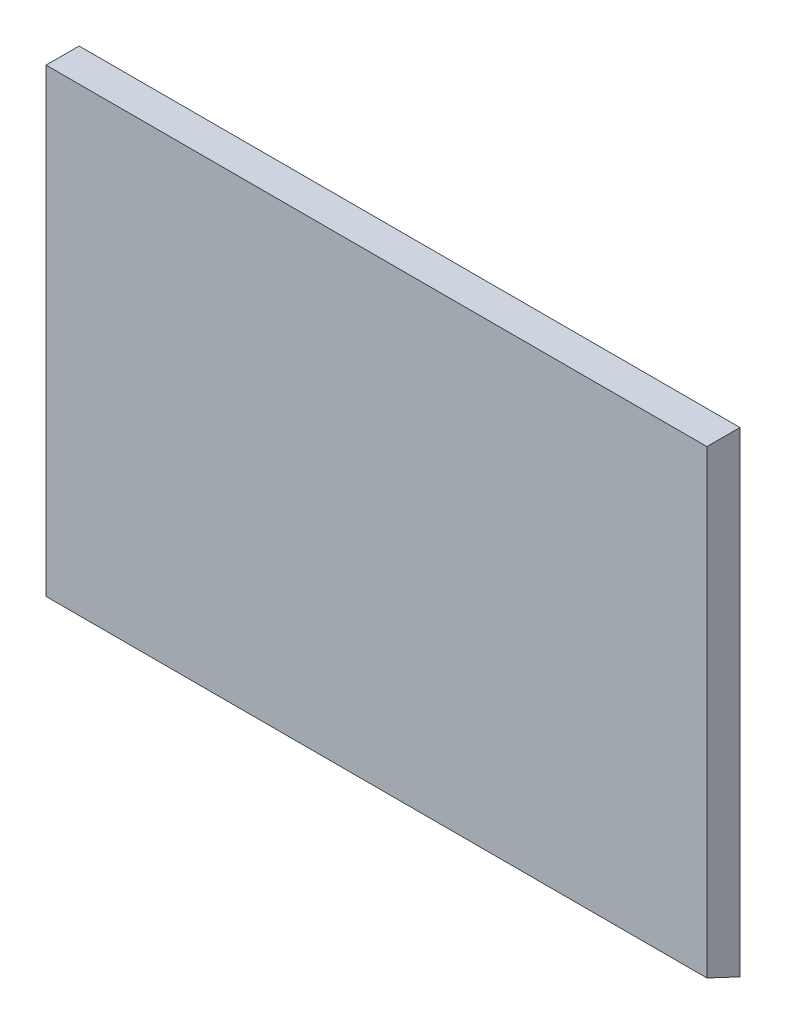
ISO-10303-21;
HEADER;
FILE_DESCRIPTION(('STEP AP214'),'2;1');
FILE_NAME('part.step','',(''),(''),'','','');
FILE_SCHEMA(('AUTOMOTIVE_DESIGN { 1 0 10303 214 1 1 1 1 }'));
ENDSEC;
DATA;
#1=APPLICATION_CONTEXT('core data for automotive mechanical design processes');
#2=APPLICATION_PROTOCOL_DEFINITION('international standard','automotive_design',2000,#1);
#3=PRODUCT_CONTEXT('',#1,'mechanical');
#4=PRODUCT('Part','Part','',(#3));
#5=PRODUCT_RELATED_PRODUCT_CATEGORY('part','',(#4));
#6=PRODUCT_DEFINITION_FORMATION('','',#4);
#7=PRODUCT_DEFINITION_CONTEXT('part definition',#1,'design');
#8=PRODUCT_DEFINITION('design','',#6,#7);
#9=PRODUCT_DEFINITION_SHAPE('','',#8);
#10=(LENGTH_UNIT() NAMED_UNIT(*) SI_UNIT(.MILLI.,.METRE.));
#11=(NAMED_UNIT(*) PLANE_ANGLE_UNIT() SI_UNIT($,.RADIAN.));
#12=(NAMED_UNIT(*) SI_UNIT($,.STERADIAN.) SOLID_ANGLE_UNIT());
#13=UNCERTAINTY_MEASURE_WITH_UNIT(LENGTH_MEASURE(1.E-05),#10,'distance_accuracy_value','');
#14=(GEOMETRIC_REPRESENTATION_CONTEXT(3) GLOBAL_UNCERTAINTY_ASSIGNED_CONTEXT((#13)) GLOBAL_UNIT_ASSIGNED_CONTEXT((#10,
#11,#12)) REPRESENTATION_CONTEXT('',''));
#15=CARTESIAN_POINT('',(0.,0.,0.));
#16=DIRECTION('',(0.,0.,1.));
#17=DIRECTION('',(1.,0.,0.));
#18=AXIS2_PLACEMENT_3D('',#15,#16,#17);
#19=CARTESIAN_POINT('',(-6.5,9.75,-0.2));
#20=DIRECTION('',(1.,0.,0.));
#21=DIRECTION('',(0.,0.,-1.));
#22=AXIS2_PLACEMENT_3D('',#19,#20,#21);
#23=PLANE('',#22);
#24=DIRECTION('',(0.,-1.,0.));
#25=VECTOR('',#24,1.);
#26=CARTESIAN_POINT('',(-6.5,9.75,-0.2));
#27=LINE('',#26,#25);
#28=CARTESIAN_POINT('',(-6.5,9.75,-0.2));
#29=VERTEX_POINT('',#28);
#30=CARTESIAN_POINT('',(-6.5,-0.329523645103672,-0.2));
#31=VERTEX_POINT('',#30);
#32=EDGE_CURVE('E76',#29,#31,#27,.T.);
#33=ORIENTED_EDGE('',*,*,#32,.T.);
#34=DIRECTION('',(0.,-0.425915422385666,-0.904762981655439));
#35=VECTOR('',#34,1.);
#36=CARTESIAN_POINT('',(-6.5,-0.329523645103672,-0.2));
#37=LINE('',#36,#35);
#38=CARTESIAN_POINT('',(-6.5,0.,0.5));
#39=VERTEX_POINT('',#38);
#40=EDGE_CURVE('E80',#39,#31,#37,.T.);
#41=ORIENTED_EDGE('',*,*,#40,.F.);
#42=DIRECTION('',(0.,-1.,0.));
#43=VECTOR('',#42,1.);
#44=CARTESIAN_POINT('',(-6.5,9.75,0.5));
#45=LINE('',#44,#43);
#46=CARTESIAN_POINT('',(-6.5,9.75,0.5));
#47=VERTEX_POINT('',#46);
#48=EDGE_CURVE('E11',#47,#39,#45,.T.);
#49=ORIENTED_EDGE('',*,*,#48,.F.);
#50=DIRECTION('',(0.,0.,1.));
#51=VECTOR('',#50,1.);
#52=CARTESIAN_POINT('',(-6.5,9.75,-0.2));
#53=LINE('',#52,#51);
#54=EDGE_CURVE('E81',#29,#47,#53,.T.);
#55=ORIENTED_EDGE('',*,*,#54,.F.);
#56=EDGE_LOOP('',(#33,#41,#49,#55));
#57=FACE_BOUND('',#56,.T.);
#58=ADVANCED_FACE('F40',(#57),#23,.F.);
#59=CARTESIAN_POINT('',(-6.5,9.75,0.5));
#60=DIRECTION('',(0.,0.,-1.));
#61=DIRECTION('',(-1.,0.,0.));
#62=AXIS2_PLACEMENT_3D('',#59,#60,#61);
#63=PLANE('',#62);
#64=DIRECTION('',(1.,0.,0.));
#65=VECTOR('',#64,1.);
#66=CARTESIAN_POINT('',(-6.5,0.,0.5));
#67=LINE('',#66,#65);
#68=CARTESIAN_POINT('',(7.5,0.,0.5));
#69=VERTEX_POINT('',#68);
#70=EDGE_CURVE('E92',#39,#69,#67,.T.);
#71=ORIENTED_EDGE('',*,*,#70,.T.);
#72=DIRECTION('',(0.,-1.,0.));
#73=VECTOR('',#72,1.);
#74=CARTESIAN_POINT('',(7.5,9.75,0.5));
#75=LINE('',#74,#73);
#76=CARTESIAN_POINT('',(7.5,9.75,0.5));
#77=VERTEX_POINT('',#76);
#78=EDGE_CURVE('E48',#77,#69,#75,.T.);
#79=ORIENTED_EDGE('',*,*,#78,.F.);
#80=DIRECTION('',(1.,0.,0.));
#81=VECTOR('',#80,1.);
#82=CARTESIAN_POINT('',(-6.5,9.75,0.5));
#83=LINE('',#82,#81);
#84=EDGE_CURVE('E101',#47,#77,#83,.T.);
#85=ORIENTED_EDGE('',*,*,#84,.F.);
#86=ORIENTED_EDGE('',*,*,#48,.T.);
#87=EDGE_LOOP('',(#71,#79,#85,#86));
#88=FACE_BOUND('',#87,.T.);
#89=ADVANCED_FACE('F113',(#88),#63,.F.);
#90=CARTESIAN_POINT('',(7.5,9.75,-0.2));
#91=DIRECTION('',(-1.,0.,0.));
#92=DIRECTION('',(0.,0.,1.));
#93=AXIS2_PLACEMENT_3D('',#90,#91,#92);
#94=PLANE('',#93);
#95=ORIENTED_EDGE('',*,*,#78,.T.);
#96=DIRECTION('',(0.,-0.425915422385666,-0.904762981655439));
#97=VECTOR('',#96,1.);
#98=CARTESIAN_POINT('',(7.5,-0.329523645103672,-0.2));
#99=LINE('',#98,#97);
#100=CARTESIAN_POINT('',(7.5,-0.329523645103672,-0.2));
#101=VERTEX_POINT('',#100);
#102=EDGE_CURVE('E96',#69,#101,#99,.T.);
#103=ORIENTED_EDGE('',*,*,#102,.T.);
#104=DIRECTION('',(0.,-1.,0.));
#105=VECTOR('',#104,1.);
#106=CARTESIAN_POINT('',(7.5,9.75,-0.2));
#107=LINE('',#106,#105);
#108=CARTESIAN_POINT('',(7.5,9.75,-0.2));
#109=VERTEX_POINT('',#108);
#110=EDGE_CURVE('E83',#109,#101,#107,.T.);
#111=ORIENTED_EDGE('',*,*,#110,.F.);
#112=DIRECTION('',(0.,0.,-1.));
#113=VECTOR('',#112,1.);
#114=CARTESIAN_POINT('',(7.5,9.75,-0.2));
#115=LINE('',#114,#113);
#116=EDGE_CURVE('E103',#77,#109,#115,.T.);
#117=ORIENTED_EDGE('',*,*,#116,.F.);
#118=EDGE_LOOP('',(#95,#103,#111,#117));
#119=FACE_BOUND('',#118,.T.);
#120=ADVANCED_FACE('F111',(#119),#94,.F.);
#121=CARTESIAN_POINT('',(-6.5,9.75,-0.2));
#122=DIRECTION('',(0.,0.,1.));
#123=DIRECTION('',(1.,0.,0.));
#124=AXIS2_PLACEMENT_3D('',#121,#122,#123);
#125=PLANE('',#124);
#126=ORIENTED_EDGE('',*,*,#110,.T.);
#127=DIRECTION('',(1.,0.,0.));
#128=VECTOR('',#127,1.);
#129=CARTESIAN_POINT('',(-6.5,-0.329523645103672,-0.2));
#130=LINE('',#129,#128);
#131=EDGE_CURVE('E86',#31,#101,#130,.T.);
#132=ORIENTED_EDGE('',*,*,#131,.F.);
#133=ORIENTED_EDGE('',*,*,#32,.F.);
#134=DIRECTION('',(-1.,0.,0.));
#135=VECTOR('',#134,1.);
#136=CARTESIAN_POINT('',(-6.5,9.75,-0.2));
#137=LINE('',#136,#135);
#138=EDGE_CURVE('E55',#109,#29,#137,.T.);
#139=ORIENTED_EDGE('',*,*,#138,.F.);
#140=EDGE_LOOP('',(#126,#132,#133,#139));
#141=FACE_BOUND('',#140,.T.);
#142=ADVANCED_FACE('F87',(#141),#125,.F.);
#143=CARTESIAN_POINT('',(0.,9.75,0.));
#144=DIRECTION('',(0.,1.,0.));
#145=DIRECTION('',(0.,0.,1.));
#146=AXIS2_PLACEMENT_3D('',#143,#144,#145);
#147=PLANE('',#146);
#148=ORIENTED_EDGE('',*,*,#54,.T.);
#149=ORIENTED_EDGE('',*,*,#84,.T.);
#150=ORIENTED_EDGE('',*,*,#116,.T.);
#151=ORIENTED_EDGE('',*,*,#138,.T.);
#152=EDGE_LOOP('',(#148,#149,#150,#151));
#153=FACE_BOUND('',#152,.T.);
#154=ADVANCED_FACE('F114',(#153),#147,.T.);
#155=CARTESIAN_POINT('',(-6.5,-0.329523645103672,-0.2));
#156=DIRECTION('',(0.,-0.904762981655439,0.425915422385666));
#157=DIRECTION('',(0.,-0.425915422385666,-0.904762981655439));
#158=AXIS2_PLACEMENT_3D('',#155,#156,#157);
#159=PLANE('',#158);
#160=ORIENTED_EDGE('',*,*,#102,.F.);
#161=ORIENTED_EDGE('',*,*,#70,.F.);
#162=ORIENTED_EDGE('',*,*,#40,.T.);
#163=ORIENTED_EDGE('',*,*,#131,.T.);
#164=EDGE_LOOP('',(#160,#161,#162,#163));
#165=FACE_BOUND('',#164,.T.);
#166=ADVANCED_FACE('F94',(#165),#159,.T.);
#167=CLOSED_SHELL('',(#58,#89,#120,#142,#154,#166));
#168=MANIFOLD_SOLID_BREP('B2',#167);
#169=ADVANCED_BREP_SHAPE_REPRESENTATION('',(#18,#168),#14);
#170=SHAPE_DEFINITION_REPRESENTATION(#9,#169);
ENDSEC;
END-ISO-10303-21;
